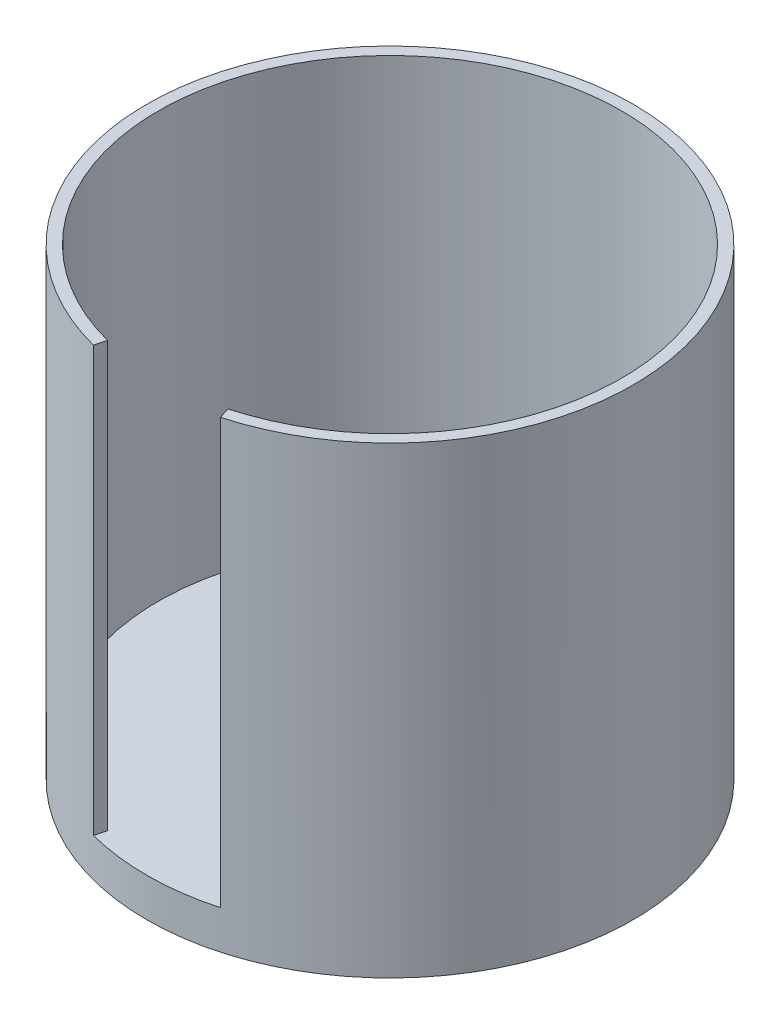
ISO-10303-21;
HEADER;
FILE_DESCRIPTION(('STEP AP214'),'2;1');
FILE_NAME('part.step','',(''),(''),'','','');
FILE_SCHEMA(('AUTOMOTIVE_DESIGN { 1 0 10303 214 1 1 1 1 }'));
ENDSEC;
DATA;
#1=APPLICATION_CONTEXT('core data for automotive mechanical design processes');
#2=APPLICATION_PROTOCOL_DEFINITION('international standard','automotive_design',2000,#1);
#3=PRODUCT_CONTEXT('',#1,'mechanical');
#4=PRODUCT('Part','Part','',(#3));
#5=PRODUCT_RELATED_PRODUCT_CATEGORY('part','',(#4));
#6=PRODUCT_DEFINITION_FORMATION('','',#4);
#7=PRODUCT_DEFINITION_CONTEXT('part definition',#1,'design');
#8=PRODUCT_DEFINITION('design','',#6,#7);
#9=PRODUCT_DEFINITION_SHAPE('','',#8);
#10=(LENGTH_UNIT() NAMED_UNIT(*) SI_UNIT(.MILLI.,.METRE.));
#11=(NAMED_UNIT(*) PLANE_ANGLE_UNIT() SI_UNIT($,.RADIAN.));
#12=(NAMED_UNIT(*) SI_UNIT($,.STERADIAN.) SOLID_ANGLE_UNIT());
#13=UNCERTAINTY_MEASURE_WITH_UNIT(LENGTH_MEASURE(1.E-05),#10,'distance_accuracy_value','');
#14=(GEOMETRIC_REPRESENTATION_CONTEXT(3) GLOBAL_UNCERTAINTY_ASSIGNED_CONTEXT((#13)) GLOBAL_UNIT_ASSIGNED_CONTEXT((#10,
#11,#12)) REPRESENTATION_CONTEXT('',''));
#15=CARTESIAN_POINT('',(0.,0.,0.));
#16=DIRECTION('',(0.,0.,1.));
#17=DIRECTION('',(1.,0.,0.));
#18=AXIS2_PLACEMENT_3D('',#15,#16,#17);
#19=CARTESIAN_POINT('',(31.5,0.,0.));
#20=DIRECTION('',(0.,-1.,0.));
#21=DIRECTION('',(0.,0.,-1.));
#22=AXIS2_PLACEMENT_3D('',#19,#20,#21);
#23=PLANE('',#22);
#24=CARTESIAN_POINT('',(0.,0.,0.));
#25=DIRECTION('',(0.,-1.,0.));
#26=DIRECTION('',(0.,0.,-1.));
#27=AXIS2_PLACEMENT_3D('',#24,#25,#26);
#28=CIRCLE('',#27,31.5);
#29=CARTESIAN_POINT('',(0.,0.,-31.5));
#30=VERTEX_POINT('',#29);
#31=EDGE_CURVE('E55',#30,#30,#28,.T.);
#32=ORIENTED_EDGE('',*,*,#31,.T.);
#33=EDGE_LOOP('',(#32));
#34=FACE_BOUND('',#33,.T.);
#35=CARTESIAN_POINT('',(0.,0.,0.));
#36=DIRECTION('',(0.,-1.,0.));
#37=DIRECTION('',(0.,0.,-1.));
#38=AXIS2_PLACEMENT_3D('',#35,#36,#37);
#39=CIRCLE('',#38,1.5);
#40=CARTESIAN_POINT('',(1.,0.,1.11803398874989));
#41=VERTEX_POINT('',#40);
#42=CARTESIAN_POINT('',(1.,0.,-1.11803398874989));
#43=VERTEX_POINT('',#42);
#44=EDGE_CURVE('E114',#41,#43,#39,.T.);
#45=ORIENTED_EDGE('',*,*,#44,.F.);
#46=DIRECTION('',(0.,0.,-1.));
#47=VECTOR('',#46,1.);
#48=CARTESIAN_POINT('',(1.,0.,0.));
#49=LINE('',#48,#47);
#50=EDGE_CURVE('E62',#41,#43,#49,.T.);
#51=ORIENTED_EDGE('',*,*,#50,.T.);
#52=EDGE_LOOP('',(#45,#51));
#53=FACE_BOUND('',#52,.T.);
#54=ADVANCED_FACE('F48',(#34,#53),#23,.T.);
#55=CARTESIAN_POINT('',(0.,60.,0.));
#56=DIRECTION('',(0.,1.,0.));
#57=DIRECTION('',(0.,0.,1.));
#58=AXIS2_PLACEMENT_3D('',#55,#56,#57);
#59=PLANE('',#58);
#60=CARTESIAN_POINT('',(0.,60.,0.));
#61=DIRECTION('',(0.,-1.,0.));
#62=DIRECTION('',(0.,0.,-1.));
#63=AXIS2_PLACEMENT_3D('',#60,#61,#62);
#64=CIRCLE('',#63,31.5);
#65=CARTESIAN_POINT('',(-7.92382159222749,60.,30.4870964733369));
#66=VERTEX_POINT('',#65);
#67=CARTESIAN_POINT('',(8.38131744274359,60.,30.3645108296505));
#68=VERTEX_POINT('',#67);
#69=EDGE_CURVE('E12',#66,#68,#64,.T.);
#70=ORIENTED_EDGE('',*,*,#69,.F.);
#71=DIRECTION('',(0.251549891816741,0.,-0.967844332486886));
#72=VECTOR('',#71,1.);
#73=CARTESIAN_POINT('',(-7.92382159222748,60.,30.4870964733369));
#74=LINE('',#73,#72);
#75=CARTESIAN_POINT('',(-7.54649675450223,60.,29.0353299746066));
#76=VERTEX_POINT('',#75);
#77=EDGE_CURVE('E121',#66,#76,#74,.T.);
#78=ORIENTED_EDGE('',*,*,#77,.T.);
#79=CARTESIAN_POINT('',(0.,60.,0.));
#80=DIRECTION('',(0.,1.,0.));
#81=DIRECTION('',(0.,0.,1.));
#82=AXIS2_PLACEMENT_3D('',#79,#80,#81);
#83=CIRCLE('',#82,30.);
#84=CARTESIAN_POINT('',(7.98220708832719,60.,28.9185817425243));
#85=VERTEX_POINT('',#84);
#86=EDGE_CURVE('E127',#85,#76,#83,.T.);
#87=ORIENTED_EDGE('',*,*,#86,.F.);
#88=DIRECTION('',(0.266073569610906,0.,0.96395272475081));
#89=VECTOR('',#88,1.);
#90=CARTESIAN_POINT('',(0.,60.,-3.78169717762944E-13));
#91=LINE('',#90,#89);
#92=EDGE_CURVE('E135',#85,#68,#91,.T.);
#93=ORIENTED_EDGE('',*,*,#92,.T.);
#94=EDGE_LOOP('',(#70,#78,#87,#93));
#95=FACE_BOUND('',#94,.T.);
#96=ADVANCED_FACE('F157',(#95),#59,.T.);
#97=CARTESIAN_POINT('',(0.,0.,0.));
#98=DIRECTION('',(0.,-1.,0.));
#99=DIRECTION('',(0.,0.,-1.));
#100=AXIS2_PLACEMENT_3D('',#97,#98,#99);
#101=CYLINDRICAL_SURFACE('',#100,31.5);
#102=ORIENTED_EDGE('',*,*,#31,.F.);
#103=EDGE_LOOP('',(#102));
#104=FACE_BOUND('',#103,.T.);
#105=CARTESIAN_POINT('',(0.,5.,-3.78169717762944E-13));
#106=DIRECTION('',(0.,1.,0.));
#107=DIRECTION('',(0.,0.,1.));
#108=AXIS2_PLACEMENT_3D('',#105,#106,#107);
#109=CIRCLE('',#108,31.5000000000004);
#110=CARTESIAN_POINT('',(-7.92382159222749,5.,30.4870964733369));
#111=VERTEX_POINT('',#110);
#112=CARTESIAN_POINT('',(8.3813174427436,5.,30.3645108296505));
#113=VERTEX_POINT('',#112);
#114=EDGE_CURVE('E70',#111,#113,#109,.T.);
#115=ORIENTED_EDGE('',*,*,#114,.F.);
#116=DIRECTION('',(0.,1.,0.));
#117=VECTOR('',#116,1.);
#118=CARTESIAN_POINT('',(-7.92382159222749,5.,30.4870964733369));
#119=LINE('',#118,#117);
#120=EDGE_CURVE('E138',#111,#66,#119,.T.);
#121=ORIENTED_EDGE('',*,*,#120,.T.);
#122=ORIENTED_EDGE('',*,*,#69,.T.);
#123=DIRECTION('',(0.,1.,0.));
#124=VECTOR('',#123,1.);
#125=CARTESIAN_POINT('',(8.38131744274359,5.,30.3645108296505));
#126=LINE('',#125,#124);
#127=EDGE_CURVE('E130',#113,#68,#126,.T.);
#128=ORIENTED_EDGE('',*,*,#127,.F.);
#129=EDGE_LOOP('',(#115,#121,#122,#128));
#130=FACE_BOUND('',#129,.T.);
#131=ADVANCED_FACE('F153',(#104,#130),#101,.T.);
#132=CARTESIAN_POINT('',(0.,5.,0.));
#133=DIRECTION('',(0.,1.,0.));
#134=DIRECTION('',(0.,0.,1.));
#135=AXIS2_PLACEMENT_3D('',#132,#133,#134);
#136=PLANE('',#135);
#137=CARTESIAN_POINT('',(0.,5.,0.));
#138=DIRECTION('',(0.,1.,0.));
#139=DIRECTION('',(0.,0.,1.));
#140=AXIS2_PLACEMENT_3D('',#137,#138,#139);
#141=CIRCLE('',#140,30.);
#142=CARTESIAN_POINT('',(7.98220708832719,5.,28.9185817425243));
#143=VERTEX_POINT('',#142);
#144=CARTESIAN_POINT('',(-7.54649675450223,5.,29.0353299746066));
#145=VERTEX_POINT('',#144);
#146=EDGE_CURVE('E123',#143,#145,#141,.T.);
#147=ORIENTED_EDGE('',*,*,#146,.T.);
#148=DIRECTION('',(0.251549891816741,0.,-0.967844332486886));
#149=VECTOR('',#148,1.);
#150=CARTESIAN_POINT('',(-7.92382159222748,5.,30.4870964733369));
#151=LINE('',#150,#149);
#152=EDGE_CURVE('E131',#111,#145,#151,.T.);
#153=ORIENTED_EDGE('',*,*,#152,.F.);
#154=ORIENTED_EDGE('',*,*,#114,.T.);
#155=DIRECTION('',(0.266073569610906,0.,0.96395272475081));
#156=VECTOR('',#155,1.);
#157=CARTESIAN_POINT('',(0.,5.,-3.78169717762944E-13));
#158=LINE('',#157,#156);
#159=EDGE_CURVE('E134',#143,#113,#158,.T.);
#160=ORIENTED_EDGE('',*,*,#159,.F.);
#161=EDGE_LOOP('',(#147,#153,#154,#160));
#162=FACE_BOUND('',#161,.T.);
#163=ADVANCED_FACE('F156',(#162),#136,.T.);
#164=CARTESIAN_POINT('',(0.,5.,0.));
#165=DIRECTION('',(0.,1.,0.));
#166=DIRECTION('',(0.,0.,1.));
#167=AXIS2_PLACEMENT_3D('',#164,#165,#166);
#168=CYLINDRICAL_SURFACE('',#167,30.);
#169=ORIENTED_EDGE('',*,*,#146,.F.);
#170=DIRECTION('',(0.,1.,0.));
#171=VECTOR('',#170,1.);
#172=CARTESIAN_POINT('',(7.98220708832724,5.,28.9185817425243));
#173=LINE('',#172,#171);
#174=EDGE_CURVE('E126',#85,#143,#173,.F.);
#175=ORIENTED_EDGE('',*,*,#174,.F.);
#176=ORIENTED_EDGE('',*,*,#86,.T.);
#177=DIRECTION('',(0.,1.,0.));
#178=VECTOR('',#177,1.);
#179=CARTESIAN_POINT('',(-7.54649675450237,5.,29.0353299746065));
#180=LINE('',#179,#178);
#181=EDGE_CURVE('E147',#145,#76,#180,.T.);
#182=ORIENTED_EDGE('',*,*,#181,.F.);
#183=EDGE_LOOP('',(#169,#175,#176,#182));
#184=FACE_BOUND('',#183,.T.);
#185=ADVANCED_FACE('F159',(#184),#168,.F.);
#186=CARTESIAN_POINT('',(-7.92382159222748,5.,30.4870964733369));
#187=DIRECTION('',(0.967844332486886,0.,0.251549891816741));
#188=DIRECTION('',(0.251549891816741,0.,-0.967844332486886));
#189=AXIS2_PLACEMENT_3D('',#186,#187,#188);
#190=PLANE('',#189);
#191=ORIENTED_EDGE('',*,*,#181,.T.);
#192=ORIENTED_EDGE('',*,*,#77,.F.);
#193=ORIENTED_EDGE('',*,*,#120,.F.);
#194=ORIENTED_EDGE('',*,*,#152,.T.);
#195=EDGE_LOOP('',(#191,#192,#193,#194));
#196=FACE_BOUND('',#195,.T.);
#197=ADVANCED_FACE('F170',(#196),#190,.T.);
#198=CARTESIAN_POINT('',(0.,5.,-3.78169717762944E-13));
#199=DIRECTION('',(-0.96395272475081,0.,0.266073569610906));
#200=DIRECTION('',(0.266073569610906,0.,0.96395272475081));
#201=AXIS2_PLACEMENT_3D('',#198,#199,#200);
#202=PLANE('',#201);
#203=ORIENTED_EDGE('',*,*,#174,.T.);
#204=ORIENTED_EDGE('',*,*,#159,.T.);
#205=ORIENTED_EDGE('',*,*,#127,.T.);
#206=ORIENTED_EDGE('',*,*,#92,.F.);
#207=EDGE_LOOP('',(#203,#204,#205,#206));
#208=FACE_BOUND('',#207,.T.);
#209=ADVANCED_FACE('F164',(#208),#202,.T.);
#210=CARTESIAN_POINT('',(1.,4.,0.));
#211=DIRECTION('',(-1.,0.,0.));
#212=DIRECTION('',(0.,0.,1.));
#213=AXIS2_PLACEMENT_3D('',#210,#211,#212);
#214=PLANE('',#213);
#215=ORIENTED_EDGE('',*,*,#50,.F.);
#216=DIRECTION('',(0.,-1.,0.));
#217=VECTOR('',#216,1.);
#218=CARTESIAN_POINT('',(1.,4.,1.11803398874989));
#219=LINE('',#218,#217);
#220=CARTESIAN_POINT('',(1.,4.,1.11803398874989));
#221=VERTEX_POINT('',#220);
#222=EDGE_CURVE('E99',#221,#41,#219,.T.);
#223=ORIENTED_EDGE('',*,*,#222,.F.);
#224=DIRECTION('',(0.,0.,-1.));
#225=VECTOR('',#224,1.);
#226=CARTESIAN_POINT('',(1.,4.,0.));
#227=LINE('',#226,#225);
#228=CARTESIAN_POINT('',(1.,4.,-1.11803398874989));
#229=VERTEX_POINT('',#228);
#230=EDGE_CURVE('E102',#221,#229,#227,.T.);
#231=ORIENTED_EDGE('',*,*,#230,.T.);
#232=DIRECTION('',(0.,-1.,0.));
#233=VECTOR('',#232,1.);
#234=CARTESIAN_POINT('',(1.,4.,-1.11803398874989));
#235=LINE('',#234,#233);
#236=EDGE_CURVE('E108',#229,#43,#235,.T.);
#237=ORIENTED_EDGE('',*,*,#236,.T.);
#238=EDGE_LOOP('',(#215,#223,#231,#237));
#239=FACE_BOUND('',#238,.T.);
#240=ADVANCED_FACE('F101',(#239),#214,.T.);
#241=CARTESIAN_POINT('',(0.,4.,0.));
#242=DIRECTION('',(0.,-1.,0.));
#243=DIRECTION('',(0.,0.,-1.));
#244=AXIS2_PLACEMENT_3D('',#241,#242,#243);
#245=CYLINDRICAL_SURFACE('',#244,1.5);
#246=ORIENTED_EDGE('',*,*,#44,.T.);
#247=ORIENTED_EDGE('',*,*,#236,.F.);
#248=CARTESIAN_POINT('',(0.,4.,0.));
#249=DIRECTION('',(0.,-1.,0.));
#250=DIRECTION('',(0.,0.,-1.));
#251=AXIS2_PLACEMENT_3D('',#248,#249,#250);
#252=CIRCLE('',#251,1.5);
#253=EDGE_CURVE('E109',#221,#229,#252,.T.);
#254=ORIENTED_EDGE('',*,*,#253,.F.);
#255=ORIENTED_EDGE('',*,*,#222,.T.);
#256=EDGE_LOOP('',(#246,#247,#254,#255));
#257=FACE_BOUND('',#256,.T.);
#258=ADVANCED_FACE('F116',(#257),#245,.F.);
#259=CARTESIAN_POINT('',(0.,4.,0.));
#260=DIRECTION('',(0.,-1.,0.));
#261=DIRECTION('',(0.,0.,-1.));
#262=AXIS2_PLACEMENT_3D('',#259,#260,#261);
#263=PLANE('',#262);
#264=ORIENTED_EDGE('',*,*,#230,.F.);
#265=ORIENTED_EDGE('',*,*,#253,.T.);
#266=EDGE_LOOP('',(#264,#265));
#267=FACE_BOUND('',#266,.T.);
#268=ADVANCED_FACE('F113',(#267),#263,.T.);
#269=CLOSED_SHELL('',(#54,#96,#131,#163,#185,#197,#209,#240,#258,#268));
#270=MANIFOLD_SOLID_BREP('B2',#269);
#271=ADVANCED_BREP_SHAPE_REPRESENTATION('',(#18,#270),#14);
#272=SHAPE_DEFINITION_REPRESENTATION(#9,#271);
ENDSEC;
END-ISO-10303-21;
